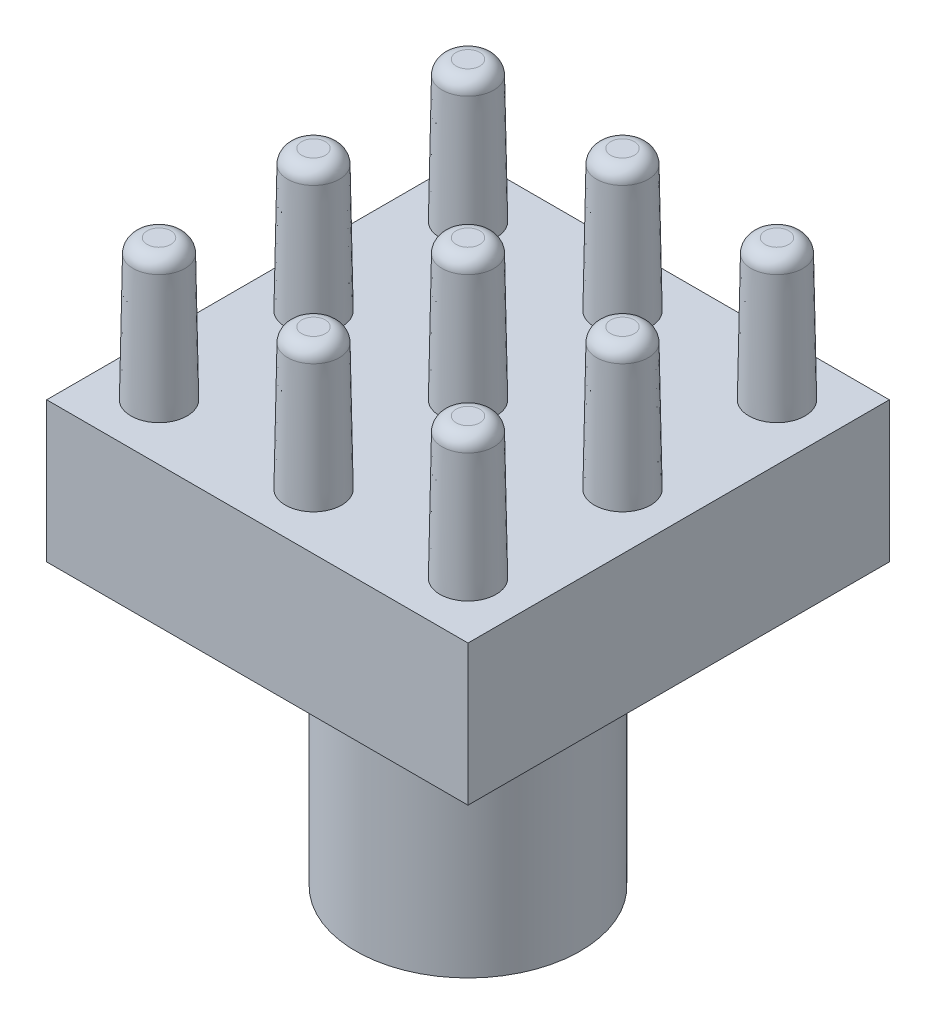
ISO-10303-21;
HEADER;
FILE_DESCRIPTION(('STEP AP214'),'2;1');
FILE_NAME('part.step','',(''),(''),'','','');
FILE_SCHEMA(('AUTOMOTIVE_DESIGN { 1 0 10303 214 1 1 1 1 }'));
ENDSEC;
DATA;
#1=APPLICATION_CONTEXT('core data for automotive mechanical design processes');
#2=APPLICATION_PROTOCOL_DEFINITION('international standard','automotive_design',2000,#1);
#3=PRODUCT_CONTEXT('',#1,'mechanical');
#4=PRODUCT('Part','Part','',(#3));
#5=PRODUCT_RELATED_PRODUCT_CATEGORY('part','',(#4));
#6=PRODUCT_DEFINITION_FORMATION('','',#4);
#7=PRODUCT_DEFINITION_CONTEXT('part definition',#1,'design');
#8=PRODUCT_DEFINITION('design','',#6,#7);
#9=PRODUCT_DEFINITION_SHAPE('','',#8);
#10=(LENGTH_UNIT() NAMED_UNIT(*) SI_UNIT(.MILLI.,.METRE.));
#11=(NAMED_UNIT(*) PLANE_ANGLE_UNIT() SI_UNIT($,.RADIAN.));
#12=(NAMED_UNIT(*) SI_UNIT($,.STERADIAN.) SOLID_ANGLE_UNIT());
#13=UNCERTAINTY_MEASURE_WITH_UNIT(LENGTH_MEASURE(1.E-05),#10,'distance_accuracy_value','');
#14=(GEOMETRIC_REPRESENTATION_CONTEXT(3) GLOBAL_UNCERTAINTY_ASSIGNED_CONTEXT((#13)) GLOBAL_UNIT_ASSIGNED_CONTEXT((#10,
#11,#12)) REPRESENTATION_CONTEXT('',''));
#15=CARTESIAN_POINT('',(0.,0.,0.));
#16=DIRECTION('',(0.,0.,1.));
#17=DIRECTION('',(1.,0.,0.));
#18=AXIS2_PLACEMENT_3D('',#15,#16,#17);
#19=CARTESIAN_POINT('',(-7.49999999999997,5.,7.49999999999999));
#20=DIRECTION('',(1.,0.,0.));
#21=DIRECTION('',(0.,0.,-1.));
#22=AXIS2_PLACEMENT_3D('',#19,#20,#21);
#23=PLANE('',#22);
#24=DIRECTION('',(0.,0.,1.));
#25=VECTOR('',#24,1.);
#26=CARTESIAN_POINT('',(-7.49999999999997,0.,7.49999999999999));
#27=LINE('',#26,#25);
#28=CARTESIAN_POINT('',(-7.49999999999997,0.,-7.50000000000001));
#29=VERTEX_POINT('',#28);
#30=CARTESIAN_POINT('',(-7.49999999999997,0.,7.49999999999999));
#31=VERTEX_POINT('',#30);
#32=EDGE_CURVE('E106',#29,#31,#27,.T.);
#33=ORIENTED_EDGE('',*,*,#32,.T.);
#34=DIRECTION('',(0.,-1.,0.));
#35=VECTOR('',#34,1.);
#36=CARTESIAN_POINT('',(-7.49999999999997,5.,7.49999999999999));
#37=LINE('',#36,#35);
#38=CARTESIAN_POINT('',(-7.49999999999997,5.,7.49999999999999));
#39=VERTEX_POINT('',#38);
#40=EDGE_CURVE('E97',#39,#31,#37,.T.);
#41=ORIENTED_EDGE('',*,*,#40,.F.);
#42=DIRECTION('',(0.,0.,1.));
#43=VECTOR('',#42,1.);
#44=CARTESIAN_POINT('',(-7.49999999999997,5.,7.49999999999999));
#45=LINE('',#44,#43);
#46=CARTESIAN_POINT('',(-7.49999999999997,5.,-7.50000000000001));
#47=VERTEX_POINT('',#46);
#48=EDGE_CURVE('E91',#47,#39,#45,.T.);
#49=ORIENTED_EDGE('',*,*,#48,.F.);
#50=DIRECTION('',(0.,-1.,0.));
#51=VECTOR('',#50,1.);
#52=CARTESIAN_POINT('',(-7.49999999999997,5.,-7.50000000000001));
#53=LINE('',#52,#51);
#54=EDGE_CURVE('E102',#47,#29,#53,.T.);
#55=ORIENTED_EDGE('',*,*,#54,.T.);
#56=EDGE_LOOP('',(#33,#41,#49,#55));
#57=FACE_BOUND('',#56,.T.);
#58=ADVANCED_FACE('F37',(#57),#23,.F.);
#59=CARTESIAN_POINT('',(7.50000000000002,5.,7.49999999999999));
#60=DIRECTION('',(0.,0.,-1.));
#61=DIRECTION('',(-1.,0.,0.));
#62=AXIS2_PLACEMENT_3D('',#59,#60,#61);
#63=PLANE('',#62);
#64=DIRECTION('',(1.,0.,0.));
#65=VECTOR('',#64,1.);
#66=CARTESIAN_POINT('',(7.50000000000002,0.,7.49999999999999));
#67=LINE('',#66,#65);
#68=CARTESIAN_POINT('',(7.50000000000002,0.,7.49999999999999));
#69=VERTEX_POINT('',#68);
#70=EDGE_CURVE('E96',#31,#69,#67,.T.);
#71=ORIENTED_EDGE('',*,*,#70,.T.);
#72=DIRECTION('',(0.,-1.,0.));
#73=VECTOR('',#72,1.);
#74=CARTESIAN_POINT('',(7.50000000000002,5.,7.49999999999999));
#75=LINE('',#74,#73);
#76=CARTESIAN_POINT('',(7.50000000000002,5.,7.49999999999999));
#77=VERTEX_POINT('',#76);
#78=EDGE_CURVE('E94',#77,#69,#75,.T.);
#79=ORIENTED_EDGE('',*,*,#78,.F.);
#80=DIRECTION('',(1.,0.,0.));
#81=VECTOR('',#80,1.);
#82=CARTESIAN_POINT('',(7.50000000000002,5.,7.49999999999999));
#83=LINE('',#82,#81);
#84=EDGE_CURVE('E86',#39,#77,#83,.T.);
#85=ORIENTED_EDGE('',*,*,#84,.F.);
#86=ORIENTED_EDGE('',*,*,#40,.T.);
#87=EDGE_LOOP('',(#71,#79,#85,#86));
#88=FACE_BOUND('',#87,.T.);
#89=ADVANCED_FACE('F95',(#88),#63,.F.);
#90=CARTESIAN_POINT('',(7.50000000000002,5.,7.49999999999999));
#91=DIRECTION('',(-1.,0.,0.));
#92=DIRECTION('',(0.,0.,1.));
#93=AXIS2_PLACEMENT_3D('',#90,#91,#92);
#94=PLANE('',#93);
#95=DIRECTION('',(0.,0.,-1.));
#96=VECTOR('',#95,1.);
#97=CARTESIAN_POINT('',(7.50000000000002,0.,7.49999999999999));
#98=LINE('',#97,#96);
#99=CARTESIAN_POINT('',(7.50000000000002,0.,-7.50000000000001));
#100=VERTEX_POINT('',#99);
#101=EDGE_CURVE('E72',#69,#100,#98,.T.);
#102=ORIENTED_EDGE('',*,*,#101,.T.);
#103=DIRECTION('',(0.,-1.,0.));
#104=VECTOR('',#103,1.);
#105=CARTESIAN_POINT('',(7.50000000000002,5.,-7.50000000000001));
#106=LINE('',#105,#104);
#107=CARTESIAN_POINT('',(7.50000000000002,5.,-7.50000000000001));
#108=VERTEX_POINT('',#107);
#109=EDGE_CURVE('E98',#108,#100,#106,.T.);
#110=ORIENTED_EDGE('',*,*,#109,.F.);
#111=DIRECTION('',(0.,0.,-1.));
#112=VECTOR('',#111,1.);
#113=CARTESIAN_POINT('',(7.50000000000002,5.,7.49999999999999));
#114=LINE('',#113,#112);
#115=EDGE_CURVE('E89',#77,#108,#114,.T.);
#116=ORIENTED_EDGE('',*,*,#115,.F.);
#117=ORIENTED_EDGE('',*,*,#78,.T.);
#118=EDGE_LOOP('',(#102,#110,#116,#117));
#119=FACE_BOUND('',#118,.T.);
#120=ADVANCED_FACE('F100',(#119),#94,.F.);
#121=CARTESIAN_POINT('',(7.50000000000002,5.,-7.50000000000001));
#122=DIRECTION('',(0.,0.,1.));
#123=DIRECTION('',(1.,0.,0.));
#124=AXIS2_PLACEMENT_3D('',#121,#122,#123);
#125=PLANE('',#124);
#126=DIRECTION('',(-1.,0.,0.));
#127=VECTOR('',#126,1.);
#128=CARTESIAN_POINT('',(7.50000000000002,0.,-7.50000000000001));
#129=LINE('',#128,#127);
#130=EDGE_CURVE('E78',#100,#29,#129,.T.);
#131=ORIENTED_EDGE('',*,*,#130,.T.);
#132=ORIENTED_EDGE('',*,*,#54,.F.);
#133=DIRECTION('',(-1.,0.,0.));
#134=VECTOR('',#133,1.);
#135=CARTESIAN_POINT('',(7.50000000000002,5.,-7.50000000000001));
#136=LINE('',#135,#134);
#137=EDGE_CURVE('E55',#108,#47,#136,.T.);
#138=ORIENTED_EDGE('',*,*,#137,.F.);
#139=ORIENTED_EDGE('',*,*,#109,.T.);
#140=EDGE_LOOP('',(#131,#132,#138,#139));
#141=FACE_BOUND('',#140,.T.);
#142=ADVANCED_FACE('F299',(#141),#125,.F.);
#143=CARTESIAN_POINT('',(0.,5.,0.));
#144=DIRECTION('',(0.,1.,0.));
#145=DIRECTION('',(0.,0.,1.));
#146=AXIS2_PLACEMENT_3D('',#143,#144,#145);
#147=PLANE('',#146);
#148=CARTESIAN_POINT('',(5.5,5.,0.));
#149=DIRECTION('',(0.,1.,0.));
#150=DIRECTION('',(0.,0.,1.));
#151=AXIS2_PLACEMENT_3D('',#148,#149,#150);
#152=CIRCLE('',#151,1.);
#153=CARTESIAN_POINT('',(5.5,5.,0.999999999999998));
#154=VERTEX_POINT('',#153);
#155=EDGE_CURVE('E490',#154,#154,#152,.T.);
#156=ORIENTED_EDGE('',*,*,#155,.F.);
#157=EDGE_LOOP('',(#156));
#158=FACE_BOUND('',#157,.T.);
#159=CARTESIAN_POINT('',(-5.5,5.,0.));
#160=DIRECTION('',(0.,1.,0.));
#161=DIRECTION('',(0.,0.,1.));
#162=AXIS2_PLACEMENT_3D('',#159,#160,#161);
#163=CIRCLE('',#162,1.);
#164=CARTESIAN_POINT('',(-5.5,5.,1.));
#165=VERTEX_POINT('',#164);
#166=EDGE_CURVE('E493',#165,#165,#163,.T.);
#167=ORIENTED_EDGE('',*,*,#166,.F.);
#168=EDGE_LOOP('',(#167));
#169=FACE_BOUND('',#168,.T.);
#170=CARTESIAN_POINT('',(5.5,5.,5.5));
#171=DIRECTION('',(0.,1.,0.));
#172=DIRECTION('',(0.,0.,1.));
#173=AXIS2_PLACEMENT_3D('',#170,#171,#172);
#174=CIRCLE('',#173,1.);
#175=CARTESIAN_POINT('',(5.5,5.,6.5));
#176=VERTEX_POINT('',#175);
#177=EDGE_CURVE('E498',#176,#176,#174,.T.);
#178=ORIENTED_EDGE('',*,*,#177,.F.);
#179=EDGE_LOOP('',(#178));
#180=FACE_BOUND('',#179,.T.);
#181=CARTESIAN_POINT('',(0.,5.,5.5));
#182=DIRECTION('',(0.,1.,0.));
#183=DIRECTION('',(0.,0.,1.));
#184=AXIS2_PLACEMENT_3D('',#181,#182,#183);
#185=CIRCLE('',#184,1.);
#186=CARTESIAN_POINT('',(0.,5.,6.5));
#187=VERTEX_POINT('',#186);
#188=EDGE_CURVE('E501',#187,#187,#185,.T.);
#189=ORIENTED_EDGE('',*,*,#188,.F.);
#190=EDGE_LOOP('',(#189));
#191=FACE_BOUND('',#190,.T.);
#192=CARTESIAN_POINT('',(-5.5,5.,5.5));
#193=DIRECTION('',(0.,1.,0.));
#194=DIRECTION('',(0.,0.,1.));
#195=AXIS2_PLACEMENT_3D('',#192,#193,#194);
#196=CIRCLE('',#195,1.);
#197=CARTESIAN_POINT('',(-5.5,5.,6.5));
#198=VERTEX_POINT('',#197);
#199=EDGE_CURVE('E504',#198,#198,#196,.T.);
#200=ORIENTED_EDGE('',*,*,#199,.F.);
#201=EDGE_LOOP('',(#200));
#202=FACE_BOUND('',#201,.T.);
#203=CARTESIAN_POINT('',(0.,5.,0.));
#204=DIRECTION('',(0.,1.,0.));
#205=DIRECTION('',(0.,0.,1.));
#206=AXIS2_PLACEMENT_3D('',#203,#204,#205);
#207=CIRCLE('',#206,1.);
#208=CARTESIAN_POINT('',(0.,5.,0.999999999999999));
#209=VERTEX_POINT('',#208);
#210=EDGE_CURVE('E507',#209,#209,#207,.T.);
#211=ORIENTED_EDGE('',*,*,#210,.F.);
#212=EDGE_LOOP('',(#211));
#213=FACE_BOUND('',#212,.T.);
#214=CARTESIAN_POINT('',(5.5,5.,-5.5));
#215=DIRECTION('',(0.,1.,0.));
#216=DIRECTION('',(0.,0.,1.));
#217=AXIS2_PLACEMENT_3D('',#214,#215,#216);
#218=CIRCLE('',#217,1.);
#219=CARTESIAN_POINT('',(5.5,5.,-4.5));
#220=VERTEX_POINT('',#219);
#221=EDGE_CURVE('E510',#220,#220,#218,.T.);
#222=ORIENTED_EDGE('',*,*,#221,.F.);
#223=EDGE_LOOP('',(#222));
#224=FACE_BOUND('',#223,.T.);
#225=CARTESIAN_POINT('',(0.,5.,-5.5));
#226=DIRECTION('',(0.,1.,0.));
#227=DIRECTION('',(0.,0.,1.));
#228=AXIS2_PLACEMENT_3D('',#225,#226,#227);
#229=CIRCLE('',#228,1.);
#230=CARTESIAN_POINT('',(0.,5.,-4.5));
#231=VERTEX_POINT('',#230);
#232=EDGE_CURVE('E513',#231,#231,#229,.T.);
#233=ORIENTED_EDGE('',*,*,#232,.F.);
#234=EDGE_LOOP('',(#233));
#235=FACE_BOUND('',#234,.T.);
#236=CARTESIAN_POINT('',(-5.5,5.,-5.5));
#237=DIRECTION('',(0.,1.,0.));
#238=DIRECTION('',(0.,0.,1.));
#239=AXIS2_PLACEMENT_3D('',#236,#237,#238);
#240=CIRCLE('',#239,1.);
#241=CARTESIAN_POINT('',(-5.5,5.,-4.5));
#242=VERTEX_POINT('',#241);
#243=EDGE_CURVE('E109',#242,#242,#240,.T.);
#244=ORIENTED_EDGE('',*,*,#243,.F.);
#245=EDGE_LOOP('',(#244));
#246=FACE_BOUND('',#245,.T.);
#247=ORIENTED_EDGE('',*,*,#48,.T.);
#248=ORIENTED_EDGE('',*,*,#84,.T.);
#249=ORIENTED_EDGE('',*,*,#115,.T.);
#250=ORIENTED_EDGE('',*,*,#137,.T.);
#251=EDGE_LOOP('',(#247,#248,#249,#250));
#252=FACE_BOUND('',#251,.T.);
#253=ADVANCED_FACE('F87',(#158,#169,#180,#191,#202,#213,#224,#235,#246,#252),#147,.T.);
#254=CARTESIAN_POINT('',(0.,0.,0.));
#255=DIRECTION('',(0.,1.,0.));
#256=DIRECTION('',(0.,0.,1.));
#257=AXIS2_PLACEMENT_3D('',#254,#255,#256);
#258=PLANE('',#257);
#259=CARTESIAN_POINT('',(0.,0.,0.));
#260=DIRECTION('',(0.,-1.,0.));
#261=DIRECTION('',(0.,0.,-1.));
#262=AXIS2_PLACEMENT_3D('',#259,#260,#261);
#263=CIRCLE('',#262,4.);
#264=CARTESIAN_POINT('',(0.,0.,-4.));
#265=VERTEX_POINT('',#264);
#266=EDGE_CURVE('E11',#265,#265,#263,.T.);
#267=ORIENTED_EDGE('',*,*,#266,.F.);
#268=EDGE_LOOP('',(#267));
#269=FACE_BOUND('',#268,.T.);
#270=ORIENTED_EDGE('',*,*,#32,.F.);
#271=ORIENTED_EDGE('',*,*,#130,.F.);
#272=ORIENTED_EDGE('',*,*,#101,.F.);
#273=ORIENTED_EDGE('',*,*,#70,.F.);
#274=EDGE_LOOP('',(#270,#271,#272,#273));
#275=FACE_BOUND('',#274,.T.);
#276=ADVANCED_FACE('F295',(#269,#275),#258,.F.);
#277=CARTESIAN_POINT('',(-5.5,5.,-5.5));
#278=DIRECTION('',(0.,-1.,0.));
#279=DIRECTION('',(0.,0.,1.));
#280=AXIS2_PLACEMENT_3D('',#277,#278,#279);
#281=CONICAL_SURFACE('',#280,1.,0.0174532925199433);
#282=CARTESIAN_POINT('',(-5.5,9.50872620321864,-5.5));
#283=DIRECTION('',(0.,-1.,0.));
#284=DIRECTION('',(0.,0.,-1.));
#285=AXIS2_PLACEMENT_3D('',#282,#283,#284);
#286=CIRCLE('',#285,0.921299891379262);
#287=CARTESIAN_POINT('',(-5.5,9.50872620321864,-6.42129989137926));
#288=VERTEX_POINT('',#287);
#289=EDGE_CURVE('E149',#288,#288,#286,.T.);
#290=ORIENTED_EDGE('',*,*,#289,.T.);
#291=EDGE_LOOP('',(#290));
#292=FACE_BOUND('',#291,.T.);
#293=ORIENTED_EDGE('',*,*,#243,.T.);
#294=EDGE_LOOP('',(#293));
#295=FACE_BOUND('',#294,.T.);
#296=ADVANCED_FACE('F291',(#292,#295),#281,.T.);
#297=CARTESIAN_POINT('',(-5.5,10.,-5.5));
#298=DIRECTION('',(0.,1.,0.));
#299=DIRECTION('',(0.,0.,1.));
#300=AXIS2_PLACEMENT_3D('',#297,#298,#299);
#301=PLANE('',#300);
#302=CARTESIAN_POINT('',(-5.5,10.,-5.5));
#303=DIRECTION('',(0.,1.,0.));
#304=DIRECTION('',(0.,0.,1.));
#305=AXIS2_PLACEMENT_3D('',#302,#303,#304);
#306=CIRCLE('',#305,0.421376043801067);
#307=CARTESIAN_POINT('',(-5.5,10.,-5.07862395619893));
#308=VERTEX_POINT('',#307);
#309=EDGE_CURVE('E146',#308,#308,#306,.T.);
#310=ORIENTED_EDGE('',*,*,#309,.T.);
#311=EDGE_LOOP('',(#310));
#312=FACE_BOUND('',#311,.T.);
#313=ADVANCED_FACE('F284',(#312),#301,.T.);
#314=CARTESIAN_POINT('',(0.,5.,-5.5));
#315=DIRECTION('',(0.,-1.,0.));
#316=DIRECTION('',(0.,0.,1.));
#317=AXIS2_PLACEMENT_3D('',#314,#315,#316);
#318=CONICAL_SURFACE('',#317,1.,0.0174532925199433);
#319=CARTESIAN_POINT('',(0.,9.50872620321864,-5.5));
#320=DIRECTION('',(0.,-1.,0.));
#321=DIRECTION('',(0.,0.,-1.));
#322=AXIS2_PLACEMENT_3D('',#319,#320,#321);
#323=CIRCLE('',#322,0.921299891379262);
#324=CARTESIAN_POINT('',(0.,9.50872620321864,-6.42129989137926));
#325=VERTEX_POINT('',#324);
#326=EDGE_CURVE('E137',#325,#325,#323,.T.);
#327=ORIENTED_EDGE('',*,*,#326,.T.);
#328=EDGE_LOOP('',(#327));
#329=FACE_BOUND('',#328,.T.);
#330=ORIENTED_EDGE('',*,*,#232,.T.);
#331=EDGE_LOOP('',(#330));
#332=FACE_BOUND('',#331,.T.);
#333=ADVANCED_FACE('F281',(#329,#332),#318,.T.);
#334=CARTESIAN_POINT('',(0.,10.,-5.5));
#335=DIRECTION('',(0.,1.,0.));
#336=DIRECTION('',(0.,0.,1.));
#337=AXIS2_PLACEMENT_3D('',#334,#335,#336);
#338=PLANE('',#337);
#339=CARTESIAN_POINT('',(0.,10.,-5.5));
#340=DIRECTION('',(0.,1.,0.));
#341=DIRECTION('',(0.,0.,1.));
#342=AXIS2_PLACEMENT_3D('',#339,#340,#341);
#343=CIRCLE('',#342,0.421376043801067);
#344=CARTESIAN_POINT('',(0.,10.,-5.07862395619893));
#345=VERTEX_POINT('',#344);
#346=EDGE_CURVE('E134',#345,#345,#343,.T.);
#347=ORIENTED_EDGE('',*,*,#346,.T.);
#348=EDGE_LOOP('',(#347));
#349=FACE_BOUND('',#348,.T.);
#350=ADVANCED_FACE('F276',(#349),#338,.T.);
#351=CARTESIAN_POINT('',(5.5,5.,-5.5));
#352=DIRECTION('',(0.,-1.,0.));
#353=DIRECTION('',(0.,0.,1.));
#354=AXIS2_PLACEMENT_3D('',#351,#352,#353);
#355=CONICAL_SURFACE('',#354,1.,0.0174532925199433);
#356=CARTESIAN_POINT('',(5.5,9.50872620321864,-5.5));
#357=DIRECTION('',(0.,-1.,0.));
#358=DIRECTION('',(0.,0.,-1.));
#359=AXIS2_PLACEMENT_3D('',#356,#357,#358);
#360=CIRCLE('',#359,0.921299891379262);
#361=CARTESIAN_POINT('',(5.5,9.50872620321864,-6.42129989137926));
#362=VERTEX_POINT('',#361);
#363=EDGE_CURVE('E131',#362,#362,#360,.T.);
#364=ORIENTED_EDGE('',*,*,#363,.T.);
#365=EDGE_LOOP('',(#364));
#366=FACE_BOUND('',#365,.T.);
#367=ORIENTED_EDGE('',*,*,#221,.T.);
#368=EDGE_LOOP('',(#367));
#369=FACE_BOUND('',#368,.T.);
#370=ADVANCED_FACE('F273',(#366,#369),#355,.T.);
#371=CARTESIAN_POINT('',(5.5,10.,-5.5));
#372=DIRECTION('',(0.,1.,0.));
#373=DIRECTION('',(0.,0.,1.));
#374=AXIS2_PLACEMENT_3D('',#371,#372,#373);
#375=PLANE('',#374);
#376=CARTESIAN_POINT('',(5.5,10.,-5.5));
#377=DIRECTION('',(0.,1.,0.));
#378=DIRECTION('',(0.,0.,1.));
#379=AXIS2_PLACEMENT_3D('',#376,#377,#378);
#380=CIRCLE('',#379,0.421376043801067);
#381=CARTESIAN_POINT('',(5.5,10.,-5.07862395619894));
#382=VERTEX_POINT('',#381);
#383=EDGE_CURVE('E128',#382,#382,#380,.T.);
#384=ORIENTED_EDGE('',*,*,#383,.T.);
#385=EDGE_LOOP('',(#384));
#386=FACE_BOUND('',#385,.T.);
#387=ADVANCED_FACE('F268',(#386),#375,.T.);
#388=CARTESIAN_POINT('',(0.,5.,0.));
#389=DIRECTION('',(0.,-1.,0.));
#390=DIRECTION('',(0.,0.,1.));
#391=AXIS2_PLACEMENT_3D('',#388,#389,#390);
#392=CONICAL_SURFACE('',#391,1.,0.0174532925199433);
#393=CARTESIAN_POINT('',(0.,9.50872620321864,0.));
#394=DIRECTION('',(0.,-1.,0.));
#395=DIRECTION('',(0.,0.,-1.));
#396=AXIS2_PLACEMENT_3D('',#393,#394,#395);
#397=CIRCLE('',#396,0.921299891379262);
#398=CARTESIAN_POINT('',(0.,9.50872620321864,-0.921299891379263));
#399=VERTEX_POINT('',#398);
#400=EDGE_CURVE('E143',#399,#399,#397,.T.);
#401=ORIENTED_EDGE('',*,*,#400,.T.);
#402=EDGE_LOOP('',(#401));
#403=FACE_BOUND('',#402,.T.);
#404=ORIENTED_EDGE('',*,*,#210,.T.);
#405=EDGE_LOOP('',(#404));
#406=FACE_BOUND('',#405,.T.);
#407=ADVANCED_FACE('F265',(#403,#406),#392,.T.);
#408=CARTESIAN_POINT('',(0.,10.,0.));
#409=DIRECTION('',(0.,1.,0.));
#410=DIRECTION('',(0.,0.,1.));
#411=AXIS2_PLACEMENT_3D('',#408,#409,#410);
#412=PLANE('',#411);
#413=CARTESIAN_POINT('',(0.,10.,0.));
#414=DIRECTION('',(0.,1.,0.));
#415=DIRECTION('',(0.,0.,1.));
#416=AXIS2_PLACEMENT_3D('',#413,#414,#415);
#417=CIRCLE('',#416,0.421376043801067);
#418=CARTESIAN_POINT('',(0.,10.,0.421376043801066));
#419=VERTEX_POINT('',#418);
#420=EDGE_CURVE('E140',#419,#419,#417,.T.);
#421=ORIENTED_EDGE('',*,*,#420,.T.);
#422=EDGE_LOOP('',(#421));
#423=FACE_BOUND('',#422,.T.);
#424=ADVANCED_FACE('F260',(#423),#412,.T.);
#425=CARTESIAN_POINT('',(-5.5,5.,5.5));
#426=DIRECTION('',(0.,-1.,0.));
#427=DIRECTION('',(0.,0.,1.));
#428=AXIS2_PLACEMENT_3D('',#425,#426,#427);
#429=CONICAL_SURFACE('',#428,1.,0.0174532925199433);
#430=CARTESIAN_POINT('',(-5.5,9.50872620321864,5.5));
#431=DIRECTION('',(0.,-1.,0.));
#432=DIRECTION('',(0.,0.,-1.));
#433=AXIS2_PLACEMENT_3D('',#430,#431,#432);
#434=CIRCLE('',#433,0.921299891379262);
#435=CARTESIAN_POINT('',(-5.5,9.50872620321864,4.57870010862074));
#436=VERTEX_POINT('',#435);
#437=EDGE_CURVE('E161',#436,#436,#434,.T.);
#438=ORIENTED_EDGE('',*,*,#437,.T.);
#439=EDGE_LOOP('',(#438));
#440=FACE_BOUND('',#439,.T.);
#441=ORIENTED_EDGE('',*,*,#199,.T.);
#442=EDGE_LOOP('',(#441));
#443=FACE_BOUND('',#442,.T.);
#444=ADVANCED_FACE('F257',(#440,#443),#429,.T.);
#445=CARTESIAN_POINT('',(-5.5,10.,5.5));
#446=DIRECTION('',(0.,1.,0.));
#447=DIRECTION('',(0.,0.,1.));
#448=AXIS2_PLACEMENT_3D('',#445,#446,#447);
#449=PLANE('',#448);
#450=CARTESIAN_POINT('',(-5.5,10.,5.5));
#451=DIRECTION('',(0.,1.,0.));
#452=DIRECTION('',(0.,0.,1.));
#453=AXIS2_PLACEMENT_3D('',#450,#451,#452);
#454=CIRCLE('',#453,0.421376043801067);
#455=CARTESIAN_POINT('',(-5.5,10.,5.92137604380107));
#456=VERTEX_POINT('',#455);
#457=EDGE_CURVE('E158',#456,#456,#454,.T.);
#458=ORIENTED_EDGE('',*,*,#457,.T.);
#459=EDGE_LOOP('',(#458));
#460=FACE_BOUND('',#459,.T.);
#461=ADVANCED_FACE('F254',(#460),#449,.T.);
#462=CARTESIAN_POINT('',(0.,5.,5.5));
#463=DIRECTION('',(0.,-1.,0.));
#464=DIRECTION('',(0.,0.,1.));
#465=AXIS2_PLACEMENT_3D('',#462,#463,#464);
#466=CONICAL_SURFACE('',#465,1.,0.0174532925199433);
#467=CARTESIAN_POINT('',(0.,9.50872620321864,5.5));
#468=DIRECTION('',(0.,-1.,0.));
#469=DIRECTION('',(0.,0.,-1.));
#470=AXIS2_PLACEMENT_3D('',#467,#468,#469);
#471=CIRCLE('',#470,0.921299891379262);
#472=CARTESIAN_POINT('',(0.,9.50872620321864,4.57870010862074));
#473=VERTEX_POINT('',#472);
#474=EDGE_CURVE('E41',#473,#473,#471,.T.);
#475=ORIENTED_EDGE('',*,*,#474,.T.);
#476=EDGE_LOOP('',(#475));
#477=FACE_BOUND('',#476,.T.);
#478=ORIENTED_EDGE('',*,*,#188,.T.);
#479=EDGE_LOOP('',(#478));
#480=FACE_BOUND('',#479,.T.);
#481=ADVANCED_FACE('F170',(#477,#480),#466,.T.);
#482=CARTESIAN_POINT('',(0.,10.,5.5));
#483=DIRECTION('',(0.,1.,0.));
#484=DIRECTION('',(0.,0.,1.));
#485=AXIS2_PLACEMENT_3D('',#482,#483,#484);
#486=PLANE('',#485);
#487=CARTESIAN_POINT('',(0.,10.,5.5));
#488=DIRECTION('',(0.,1.,0.));
#489=DIRECTION('',(0.,0.,1.));
#490=AXIS2_PLACEMENT_3D('',#487,#488,#489);
#491=CIRCLE('',#490,0.421376043801067);
#492=CARTESIAN_POINT('',(0.,10.,5.92137604380107));
#493=VERTEX_POINT('',#492);
#494=EDGE_CURVE('E163',#493,#493,#491,.T.);
#495=ORIENTED_EDGE('',*,*,#494,.T.);
#496=EDGE_LOOP('',(#495));
#497=FACE_BOUND('',#496,.T.);
#498=ADVANCED_FACE('F247',(#497),#486,.T.);
#499=CARTESIAN_POINT('',(5.5,5.,5.5));
#500=DIRECTION('',(0.,-1.,0.));
#501=DIRECTION('',(0.,0.,1.));
#502=AXIS2_PLACEMENT_3D('',#499,#500,#501);
#503=CONICAL_SURFACE('',#502,1.,0.0174532925199433);
#504=CARTESIAN_POINT('',(5.5,9.50872620321864,5.5));
#505=DIRECTION('',(0.,-1.,0.));
#506=DIRECTION('',(0.,0.,-1.));
#507=AXIS2_PLACEMENT_3D('',#504,#505,#506);
#508=CIRCLE('',#507,0.921299891379262);
#509=CARTESIAN_POINT('',(5.5,9.50872620321864,4.57870010862074));
#510=VERTEX_POINT('',#509);
#511=EDGE_CURVE('E119',#510,#510,#508,.T.);
#512=ORIENTED_EDGE('',*,*,#511,.T.);
#513=EDGE_LOOP('',(#512));
#514=FACE_BOUND('',#513,.T.);
#515=ORIENTED_EDGE('',*,*,#177,.T.);
#516=EDGE_LOOP('',(#515));
#517=FACE_BOUND('',#516,.T.);
#518=ADVANCED_FACE('F244',(#514,#517),#503,.T.);
#519=CARTESIAN_POINT('',(5.5,10.,5.5));
#520=DIRECTION('',(0.,1.,0.));
#521=DIRECTION('',(0.,0.,1.));
#522=AXIS2_PLACEMENT_3D('',#519,#520,#521);
#523=PLANE('',#522);
#524=CARTESIAN_POINT('',(5.5,10.,5.5));
#525=DIRECTION('',(0.,1.,0.));
#526=DIRECTION('',(0.,0.,1.));
#527=AXIS2_PLACEMENT_3D('',#524,#525,#526);
#528=CIRCLE('',#527,0.421376043801067);
#529=CARTESIAN_POINT('',(5.5,10.,5.92137604380106));
#530=VERTEX_POINT('',#529);
#531=EDGE_CURVE('E116',#530,#530,#528,.T.);
#532=ORIENTED_EDGE('',*,*,#531,.T.);
#533=EDGE_LOOP('',(#532));
#534=FACE_BOUND('',#533,.T.);
#535=ADVANCED_FACE('F239',(#534),#523,.T.);
#536=CARTESIAN_POINT('',(-5.5,5.,0.));
#537=DIRECTION('',(0.,-1.,0.));
#538=DIRECTION('',(0.,0.,1.));
#539=AXIS2_PLACEMENT_3D('',#536,#537,#538);
#540=CONICAL_SURFACE('',#539,1.,0.0174532925199433);
#541=CARTESIAN_POINT('',(-5.5,9.50872620321864,0.));
#542=DIRECTION('',(0.,-1.,0.));
#543=DIRECTION('',(0.,0.,-1.));
#544=AXIS2_PLACEMENT_3D('',#541,#542,#543);
#545=CIRCLE('',#544,0.921299891379262);
#546=CARTESIAN_POINT('',(-5.5,9.50872620321864,-0.921299891379262));
#547=VERTEX_POINT('',#546);
#548=EDGE_CURVE('E155',#547,#547,#545,.T.);
#549=ORIENTED_EDGE('',*,*,#548,.T.);
#550=EDGE_LOOP('',(#549));
#551=FACE_BOUND('',#550,.T.);
#552=ORIENTED_EDGE('',*,*,#166,.T.);
#553=EDGE_LOOP('',(#552));
#554=FACE_BOUND('',#553,.T.);
#555=ADVANCED_FACE('F231',(#551,#554),#540,.T.);
#556=CARTESIAN_POINT('',(-5.5,10.,0.));
#557=DIRECTION('',(0.,1.,0.));
#558=DIRECTION('',(0.,0.,1.));
#559=AXIS2_PLACEMENT_3D('',#556,#557,#558);
#560=PLANE('',#559);
#561=CARTESIAN_POINT('',(-5.5,10.,0.));
#562=DIRECTION('',(0.,1.,0.));
#563=DIRECTION('',(0.,0.,1.));
#564=AXIS2_PLACEMENT_3D('',#561,#562,#563);
#565=CIRCLE('',#564,0.421376043801067);
#566=CARTESIAN_POINT('',(-5.5,10.,0.421376043801067));
#567=VERTEX_POINT('',#566);
#568=EDGE_CURVE('E152',#567,#567,#565,.T.);
#569=ORIENTED_EDGE('',*,*,#568,.T.);
#570=EDGE_LOOP('',(#569));
#571=FACE_BOUND('',#570,.T.);
#572=ADVANCED_FACE('F228',(#571),#560,.T.);
#573=CARTESIAN_POINT('',(5.5,5.,0.));
#574=DIRECTION('',(0.,-1.,0.));
#575=DIRECTION('',(0.,0.,1.));
#576=AXIS2_PLACEMENT_3D('',#573,#574,#575);
#577=CONICAL_SURFACE('',#576,1.,0.0174532925199433);
#578=CARTESIAN_POINT('',(5.5,9.50872620321864,0.));
#579=DIRECTION('',(0.,-1.,0.));
#580=DIRECTION('',(0.,0.,-1.));
#581=AXIS2_PLACEMENT_3D('',#578,#579,#580);
#582=CIRCLE('',#581,0.921299891379262);
#583=CARTESIAN_POINT('',(5.5,9.50872620321864,-0.921299891379264));
#584=VERTEX_POINT('',#583);
#585=EDGE_CURVE('E125',#584,#584,#582,.T.);
#586=ORIENTED_EDGE('',*,*,#585,.T.);
#587=EDGE_LOOP('',(#586));
#588=FACE_BOUND('',#587,.T.);
#589=ORIENTED_EDGE('',*,*,#155,.T.);
#590=EDGE_LOOP('',(#589));
#591=FACE_BOUND('',#590,.T.);
#592=ADVANCED_FACE('F230',(#588,#591),#577,.T.);
#593=CARTESIAN_POINT('',(5.5,10.,0.));
#594=DIRECTION('',(0.,1.,0.));
#595=DIRECTION('',(0.,0.,1.));
#596=AXIS2_PLACEMENT_3D('',#593,#594,#595);
#597=PLANE('',#596);
#598=CARTESIAN_POINT('',(5.5,10.,0.));
#599=DIRECTION('',(0.,1.,0.));
#600=DIRECTION('',(0.,0.,1.));
#601=AXIS2_PLACEMENT_3D('',#598,#599,#600);
#602=CIRCLE('',#601,0.421376043801067);
#603=CARTESIAN_POINT('',(5.5,10.,0.421376043801065));
#604=VERTEX_POINT('',#603);
#605=EDGE_CURVE('E122',#604,#604,#602,.T.);
#606=ORIENTED_EDGE('',*,*,#605,.T.);
#607=EDGE_LOOP('',(#606));
#608=FACE_BOUND('',#607,.T.);
#609=ADVANCED_FACE('F199',(#608),#597,.T.);
#610=CARTESIAN_POINT('',(5.5,9.5,5.5));
#611=DIRECTION('',(0.,1.,0.));
#612=DIRECTION('',(0.,0.,1.));
#613=AXIS2_PLACEMENT_3D('',#610,#611,#612);
#614=DEGENERATE_TOROIDAL_SURFACE('',#613,0.421376043801067,0.5,.T.);
#615=ORIENTED_EDGE('',*,*,#511,.F.);
#616=EDGE_LOOP('',(#615));
#617=FACE_BOUND('',#616,.T.);
#618=ORIENTED_EDGE('',*,*,#531,.F.);
#619=EDGE_LOOP('',(#618));
#620=FACE_BOUND('',#619,.T.);
#621=ADVANCED_FACE('F195',(#617,#620),#614,.T.);
#622=CARTESIAN_POINT('',(5.5,9.5,0.));
#623=DIRECTION('',(0.,1.,0.));
#624=DIRECTION('',(0.,0.,1.));
#625=AXIS2_PLACEMENT_3D('',#622,#623,#624);
#626=DEGENERATE_TOROIDAL_SURFACE('',#625,0.421376043801067,0.5,.T.);
#627=ORIENTED_EDGE('',*,*,#585,.F.);
#628=EDGE_LOOP('',(#627));
#629=FACE_BOUND('',#628,.T.);
#630=ORIENTED_EDGE('',*,*,#605,.F.);
#631=EDGE_LOOP('',(#630));
#632=FACE_BOUND('',#631,.T.);
#633=ADVANCED_FACE('F198',(#629,#632),#626,.T.);
#634=CARTESIAN_POINT('',(5.5,9.5,-5.5));
#635=DIRECTION('',(0.,1.,0.));
#636=DIRECTION('',(0.,0.,1.));
#637=AXIS2_PLACEMENT_3D('',#634,#635,#636);
#638=DEGENERATE_TOROIDAL_SURFACE('',#637,0.421376043801067,0.5,.T.);
#639=ORIENTED_EDGE('',*,*,#363,.F.);
#640=EDGE_LOOP('',(#639));
#641=FACE_BOUND('',#640,.T.);
#642=ORIENTED_EDGE('',*,*,#383,.F.);
#643=EDGE_LOOP('',(#642));
#644=FACE_BOUND('',#643,.T.);
#645=ADVANCED_FACE('F203',(#641,#644),#638,.T.);
#646=CARTESIAN_POINT('',(0.,9.5,-5.5));
#647=DIRECTION('',(0.,1.,0.));
#648=DIRECTION('',(0.,0.,1.));
#649=AXIS2_PLACEMENT_3D('',#646,#647,#648);
#650=DEGENERATE_TOROIDAL_SURFACE('',#649,0.421376043801067,0.5,.T.);
#651=ORIENTED_EDGE('',*,*,#326,.F.);
#652=EDGE_LOOP('',(#651));
#653=FACE_BOUND('',#652,.T.);
#654=ORIENTED_EDGE('',*,*,#346,.F.);
#655=EDGE_LOOP('',(#654));
#656=FACE_BOUND('',#655,.T.);
#657=ADVANCED_FACE('F207',(#653,#656),#650,.T.);
#658=CARTESIAN_POINT('',(0.,9.5,0.));
#659=DIRECTION('',(0.,1.,0.));
#660=DIRECTION('',(0.,0.,1.));
#661=AXIS2_PLACEMENT_3D('',#658,#659,#660);
#662=DEGENERATE_TOROIDAL_SURFACE('',#661,0.421376043801067,0.5,.T.);
#663=ORIENTED_EDGE('',*,*,#400,.F.);
#664=EDGE_LOOP('',(#663));
#665=FACE_BOUND('',#664,.T.);
#666=ORIENTED_EDGE('',*,*,#420,.F.);
#667=EDGE_LOOP('',(#666));
#668=FACE_BOUND('',#667,.T.);
#669=ADVANCED_FACE('F211',(#665,#668),#662,.T.);
#670=CARTESIAN_POINT('',(-5.5,9.5,-5.5));
#671=DIRECTION('',(0.,1.,0.));
#672=DIRECTION('',(0.,0.,1.));
#673=AXIS2_PLACEMENT_3D('',#670,#671,#672);
#674=DEGENERATE_TOROIDAL_SURFACE('',#673,0.421376043801067,0.5,.T.);
#675=ORIENTED_EDGE('',*,*,#289,.F.);
#676=EDGE_LOOP('',(#675));
#677=FACE_BOUND('',#676,.T.);
#678=ORIENTED_EDGE('',*,*,#309,.F.);
#679=EDGE_LOOP('',(#678));
#680=FACE_BOUND('',#679,.T.);
#681=ADVANCED_FACE('F215',(#677,#680),#674,.T.);
#682=CARTESIAN_POINT('',(-5.5,9.5,0.));
#683=DIRECTION('',(0.,1.,0.));
#684=DIRECTION('',(0.,0.,1.));
#685=AXIS2_PLACEMENT_3D('',#682,#683,#684);
#686=DEGENERATE_TOROIDAL_SURFACE('',#685,0.421376043801067,0.5,.T.);
#687=ORIENTED_EDGE('',*,*,#548,.F.);
#688=EDGE_LOOP('',(#687));
#689=FACE_BOUND('',#688,.T.);
#690=ORIENTED_EDGE('',*,*,#568,.F.);
#691=EDGE_LOOP('',(#690));
#692=FACE_BOUND('',#691,.T.);
#693=ADVANCED_FACE('F184',(#689,#692),#686,.T.);
#694=CARTESIAN_POINT('',(-5.5,9.5,5.5));
#695=DIRECTION('',(0.,1.,0.));
#696=DIRECTION('',(0.,0.,1.));
#697=AXIS2_PLACEMENT_3D('',#694,#695,#696);
#698=DEGENERATE_TOROIDAL_SURFACE('',#697,0.421376043801067,0.5,.T.);
#699=ORIENTED_EDGE('',*,*,#437,.F.);
#700=EDGE_LOOP('',(#699));
#701=FACE_BOUND('',#700,.T.);
#702=ORIENTED_EDGE('',*,*,#457,.F.);
#703=EDGE_LOOP('',(#702));
#704=FACE_BOUND('',#703,.T.);
#705=ADVANCED_FACE('F176',(#701,#704),#698,.T.);
#706=CARTESIAN_POINT('',(0.,9.5,5.5));
#707=DIRECTION('',(0.,1.,0.));
#708=DIRECTION('',(0.,0.,1.));
#709=AXIS2_PLACEMENT_3D('',#706,#707,#708);
#710=DEGENERATE_TOROIDAL_SURFACE('',#709,0.421376043801067,0.5,.T.);
#711=ORIENTED_EDGE('',*,*,#474,.F.);
#712=EDGE_LOOP('',(#711));
#713=FACE_BOUND('',#712,.T.);
#714=ORIENTED_EDGE('',*,*,#494,.F.);
#715=EDGE_LOOP('',(#714));
#716=FACE_BOUND('',#715,.T.);
#717=ADVANCED_FACE('F39',(#713,#716),#710,.T.);
#718=CARTESIAN_POINT('',(0.,-10.,0.));
#719=DIRECTION('',(0.,1.,0.));
#720=DIRECTION('',(0.,0.,1.));
#721=AXIS2_PLACEMENT_3D('',#718,#719,#720);
#722=CYLINDRICAL_SURFACE('',#721,4.);
#723=CARTESIAN_POINT('',(0.,-10.,0.));
#724=DIRECTION('',(0.,-1.,0.));
#725=DIRECTION('',(0.,0.,-1.));
#726=AXIS2_PLACEMENT_3D('',#723,#724,#725);
#727=CIRCLE('',#726,4.);
#728=CARTESIAN_POINT('',(0.,-10.,-4.));
#729=VERTEX_POINT('',#728);
#730=EDGE_CURVE('E489',#729,#729,#727,.T.);
#731=ORIENTED_EDGE('',*,*,#730,.F.);
#732=EDGE_LOOP('',(#731));
#733=FACE_BOUND('',#732,.T.);
#734=ORIENTED_EDGE('',*,*,#266,.T.);
#735=EDGE_LOOP('',(#734));
#736=FACE_BOUND('',#735,.T.);
#737=ADVANCED_FACE('F175',(#733,#736),#722,.T.);
#738=CARTESIAN_POINT('',(0.,-10.,0.));
#739=DIRECTION('',(0.,-1.,0.));
#740=DIRECTION('',(0.,0.,-1.));
#741=AXIS2_PLACEMENT_3D('',#738,#739,#740);
#742=PLANE('',#741);
#743=ORIENTED_EDGE('',*,*,#730,.T.);
#744=EDGE_LOOP('',(#743));
#745=FACE_BOUND('',#744,.T.);
#746=ADVANCED_FACE('F181',(#745),#742,.T.);
#747=CLOSED_SHELL('',(#58,#89,#120,#142,#253,#276,#296,#313,#333,#350,#370,#387,#407,#424,#444,
#461,#481,#498,#518,#535,#555,#572,#592,#609,#621,#633,#645,#657,#669,#681,#693,#705,#717,#737,#746));
#748=MANIFOLD_SOLID_BREP('B2',#747);
#749=ADVANCED_BREP_SHAPE_REPRESENTATION('',(#18,#748),#14);
#750=SHAPE_DEFINITION_REPRESENTATION(#9,#749);
ENDSEC;
END-ISO-10303-21;
